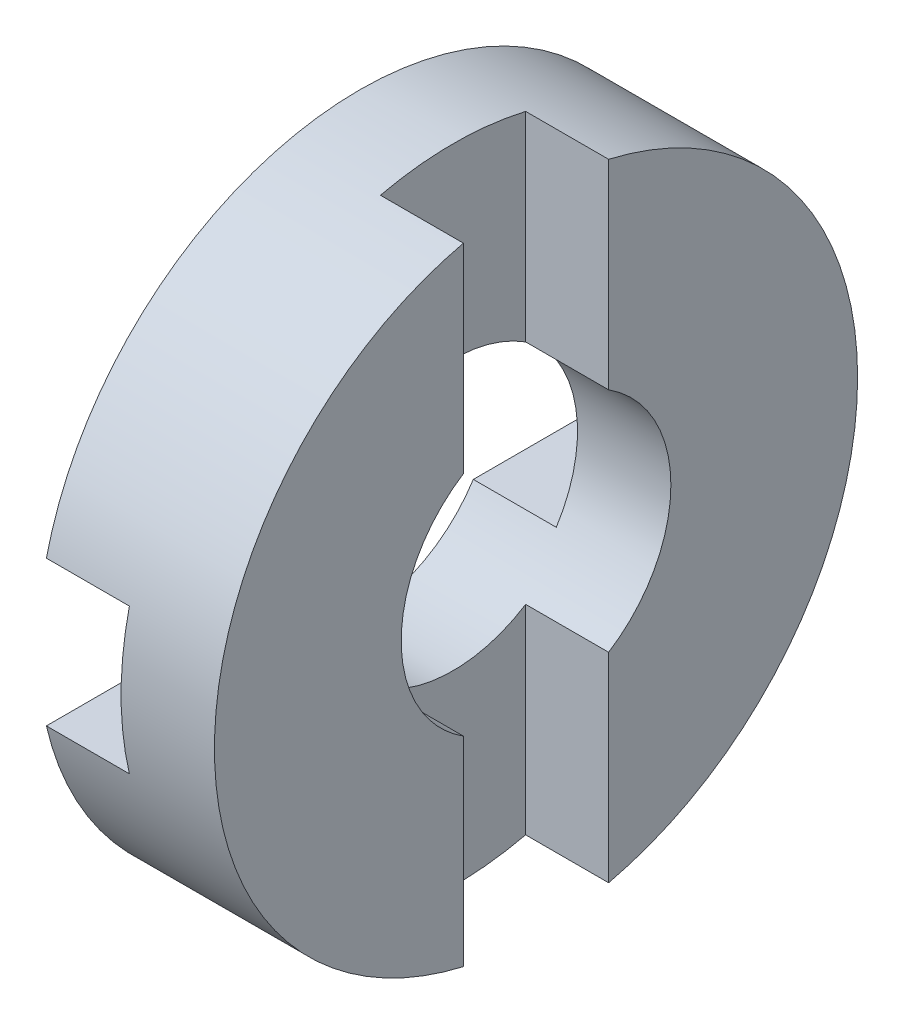
ISO-10303-21;
HEADER;
FILE_DESCRIPTION(('STEP AP214'),'2;1');
FILE_NAME('part.step','',(''),(''),'','','');
FILE_SCHEMA(('AUTOMOTIVE_DESIGN { 1 0 10303 214 1 1 1 1 }'));
ENDSEC;
DATA;
#1=APPLICATION_CONTEXT('core data for automotive mechanical design processes');
#2=APPLICATION_PROTOCOL_DEFINITION('international standard','automotive_design',2000,#1);
#3=PRODUCT_CONTEXT('',#1,'mechanical');
#4=PRODUCT('Part','Part','',(#3));
#5=PRODUCT_RELATED_PRODUCT_CATEGORY('part','',(#4));
#6=PRODUCT_DEFINITION_FORMATION('','',#4);
#7=PRODUCT_DEFINITION_CONTEXT('part definition',#1,'design');
#8=PRODUCT_DEFINITION('design','',#6,#7);
#9=PRODUCT_DEFINITION_SHAPE('','',#8);
#10=(LENGTH_UNIT() NAMED_UNIT(*) SI_UNIT(.MILLI.,.METRE.));
#11=(NAMED_UNIT(*) PLANE_ANGLE_UNIT() SI_UNIT($,.RADIAN.));
#12=(NAMED_UNIT(*) SI_UNIT($,.STERADIAN.) SOLID_ANGLE_UNIT());
#13=UNCERTAINTY_MEASURE_WITH_UNIT(LENGTH_MEASURE(1.E-05),#10,'distance_accuracy_value','');
#14=(GEOMETRIC_REPRESENTATION_CONTEXT(3) GLOBAL_UNCERTAINTY_ASSIGNED_CONTEXT((#13)) GLOBAL_UNIT_ASSIGNED_CONTEXT((#10,
#11,#12)) REPRESENTATION_CONTEXT('',''));
#15=CARTESIAN_POINT('',(0.,0.,0.));
#16=DIRECTION('',(0.,0.,1.));
#17=DIRECTION('',(1.,0.,0.));
#18=AXIS2_PLACEMENT_3D('',#15,#16,#17);
#19=CARTESIAN_POINT('',(8.5,6.5,0.));
#20=DIRECTION('',(-1.,0.,0.));
#21=DIRECTION('',(0.,0.,1.));
#22=AXIS2_PLACEMENT_3D('',#19,#20,#21);
#23=PLANE('',#22);
#24=CARTESIAN_POINT('',(8.5,0.,0.));
#25=DIRECTION('',(-1.,0.,0.));
#26=DIRECTION('',(0.,0.,1.));
#27=AXIS2_PLACEMENT_3D('',#24,#25,#26);
#28=CIRCLE('',#27,15.5);
#29=CARTESIAN_POINT('',(8.5,-15.0996688705415,3.5));
#30=VERTEX_POINT('',#29);
#31=CARTESIAN_POINT('',(8.5,15.0996688705415,3.5));
#32=VERTEX_POINT('',#31);
#33=EDGE_CURVE('E177',#30,#32,#28,.T.);
#34=ORIENTED_EDGE('',*,*,#33,.F.);
#35=DIRECTION('',(0.,1.,0.));
#36=VECTOR('',#35,1.);
#37=CARTESIAN_POINT('',(8.5,-15.5,3.5));
#38=LINE('',#37,#36);
#39=CARTESIAN_POINT('',(8.5,-5.47722557505166,3.5));
#40=VERTEX_POINT('',#39);
#41=EDGE_CURVE('E231',#30,#40,#38,.T.);
#42=ORIENTED_EDGE('',*,*,#41,.T.);
#43=CARTESIAN_POINT('',(8.5,0.,0.));
#44=DIRECTION('',(-1.,0.,0.));
#45=DIRECTION('',(0.,0.,1.));
#46=AXIS2_PLACEMENT_3D('',#43,#44,#45);
#47=CIRCLE('',#46,6.5);
#48=CARTESIAN_POINT('',(8.5,5.47722557505166,3.5));
#49=VERTEX_POINT('',#48);
#50=EDGE_CURVE('E183',#40,#49,#47,.T.);
#51=ORIENTED_EDGE('',*,*,#50,.T.);
#52=EDGE_CURVE('E227',#49,#32,#38,.T.);
#53=ORIENTED_EDGE('',*,*,#52,.T.);
#54=EDGE_LOOP('',(#34,#42,#51,#53));
#55=FACE_BOUND('',#54,.T.);
#56=ADVANCED_FACE('F41',(#55),#23,.F.);
#57=CARTESIAN_POINT('',(0.,6.5,0.));
#58=DIRECTION('',(1.,0.,0.));
#59=DIRECTION('',(0.,0.,-1.));
#60=AXIS2_PLACEMENT_3D('',#57,#58,#59);
#61=PLANE('',#60);
#62=CARTESIAN_POINT('',(0.,0.,0.));
#63=DIRECTION('',(-1.,0.,0.));
#64=DIRECTION('',(0.,0.,1.));
#65=AXIS2_PLACEMENT_3D('',#62,#63,#64);
#66=CIRCLE('',#65,15.5);
#67=CARTESIAN_POINT('',(0.,3.5,15.0996688705415));
#68=VERTEX_POINT('',#67);
#69=CARTESIAN_POINT('',(0.,3.5,-15.0996688705415));
#70=VERTEX_POINT('',#69);
#71=EDGE_CURVE('E180',#68,#70,#66,.T.);
#72=ORIENTED_EDGE('',*,*,#71,.T.);
#73=DIRECTION('',(0.,0.,1.));
#74=VECTOR('',#73,1.);
#75=CARTESIAN_POINT('',(0.,3.5,-15.5));
#76=LINE('',#75,#74);
#77=CARTESIAN_POINT('',(0.,3.5,-5.47722557505166));
#78=VERTEX_POINT('',#77);
#79=EDGE_CURVE('E247',#70,#78,#76,.T.);
#80=ORIENTED_EDGE('',*,*,#79,.T.);
#81=CARTESIAN_POINT('',(0.,0.,0.));
#82=DIRECTION('',(-1.,0.,0.));
#83=DIRECTION('',(0.,0.,1.));
#84=AXIS2_PLACEMENT_3D('',#81,#82,#83);
#85=CIRCLE('',#84,6.5);
#86=CARTESIAN_POINT('',(0.,3.5,5.47722557505166));
#87=VERTEX_POINT('',#86);
#88=EDGE_CURVE('E273',#87,#78,#85,.T.);
#89=ORIENTED_EDGE('',*,*,#88,.F.);
#90=EDGE_CURVE('E244',#87,#68,#76,.T.);
#91=ORIENTED_EDGE('',*,*,#90,.T.);
#92=EDGE_LOOP('',(#72,#80,#89,#91));
#93=FACE_BOUND('',#92,.T.);
#94=ADVANCED_FACE('F298',(#93),#61,.F.);
#95=CARTESIAN_POINT('',(0.,-3.5,-15.0996688705415));
#96=VERTEX_POINT('',#95);
#97=CARTESIAN_POINT('',(0.,-3.5,15.0996688705415));
#98=VERTEX_POINT('',#97);
#99=EDGE_CURVE('E176',#96,#98,#66,.T.);
#100=ORIENTED_EDGE('',*,*,#99,.T.);
#101=DIRECTION('',(0.,0.,1.));
#102=VECTOR('',#101,1.);
#103=CARTESIAN_POINT('',(0.,-3.5,-15.5));
#104=LINE('',#103,#102);
#105=CARTESIAN_POINT('',(0.,-3.5,5.47722557505166));
#106=VERTEX_POINT('',#105);
#107=EDGE_CURVE('E243',#106,#98,#104,.T.);
#108=ORIENTED_EDGE('',*,*,#107,.F.);
#109=CARTESIAN_POINT('',(0.,-3.5,-5.47722557505166));
#110=VERTEX_POINT('',#109);
#111=EDGE_CURVE('E272',#110,#106,#85,.T.);
#112=ORIENTED_EDGE('',*,*,#111,.F.);
#113=EDGE_CURVE('E256',#96,#110,#104,.T.);
#114=ORIENTED_EDGE('',*,*,#113,.F.);
#115=EDGE_LOOP('',(#100,#108,#112,#114));
#116=FACE_BOUND('',#115,.T.);
#117=ADVANCED_FACE('F43',(#116),#61,.F.);
#118=CARTESIAN_POINT('',(0.,0.,0.));
#119=DIRECTION('',(-1.,0.,0.));
#120=DIRECTION('',(0.,0.,1.));
#121=AXIS2_PLACEMENT_3D('',#118,#119,#120);
#122=CYLINDRICAL_SURFACE('',#121,15.5);
#123=CARTESIAN_POINT('',(4.,0.,0.));
#124=DIRECTION('',(1.,0.,0.));
#125=DIRECTION('',(0.,0.,-1.));
#126=AXIS2_PLACEMENT_3D('',#123,#124,#125);
#127=CIRCLE('',#126,15.5);
#128=CARTESIAN_POINT('',(4.,-3.5,-15.0996688705415));
#129=VERTEX_POINT('',#128);
#130=CARTESIAN_POINT('',(4.,3.5,-15.0996688705415));
#131=VERTEX_POINT('',#130);
#132=EDGE_CURVE('E264',#129,#131,#127,.T.);
#133=ORIENTED_EDGE('',*,*,#132,.T.);
#134=DIRECTION('',(-1.,0.,0.));
#135=VECTOR('',#134,1.);
#136=CARTESIAN_POINT('',(0.,3.5,-15.0996688705415));
#137=LINE('',#136,#135);
#138=EDGE_CURVE('E270',#131,#70,#137,.T.);
#139=ORIENTED_EDGE('',*,*,#138,.T.);
#140=ORIENTED_EDGE('',*,*,#71,.F.);
#141=DIRECTION('',(-1.,0.,0.));
#142=VECTOR('',#141,1.);
#143=CARTESIAN_POINT('',(0.,3.5,15.0996688705415));
#144=LINE('',#143,#142);
#145=CARTESIAN_POINT('',(4.,3.5,15.0996688705415));
#146=VERTEX_POINT('',#145);
#147=EDGE_CURVE('E267',#68,#146,#144,.F.);
#148=ORIENTED_EDGE('',*,*,#147,.T.);
#149=CARTESIAN_POINT('',(4.,-3.5,15.0996688705415));
#150=VERTEX_POINT('',#149);
#151=EDGE_CURVE('E266',#146,#150,#127,.T.);
#152=ORIENTED_EDGE('',*,*,#151,.T.);
#153=DIRECTION('',(-1.,0.,0.));
#154=VECTOR('',#153,1.);
#155=CARTESIAN_POINT('',(0.,-3.5,15.0996688705415));
#156=LINE('',#155,#154);
#157=EDGE_CURVE('E261',#150,#98,#156,.T.);
#158=ORIENTED_EDGE('',*,*,#157,.T.);
#159=ORIENTED_EDGE('',*,*,#99,.F.);
#160=DIRECTION('',(-1.,0.,0.));
#161=VECTOR('',#160,1.);
#162=CARTESIAN_POINT('',(0.,-3.5,-15.0996688705415));
#163=LINE('',#162,#161);
#164=EDGE_CURVE('E258',#96,#129,#163,.F.);
#165=ORIENTED_EDGE('',*,*,#164,.T.);
#166=EDGE_LOOP('',(#133,#139,#140,#148,#152,#158,#159,#165));
#167=FACE_BOUND('',#166,.T.);
#168=ORIENTED_EDGE('',*,*,#33,.T.);
#169=DIRECTION('',(-1.,0.,0.));
#170=VECTOR('',#169,1.);
#171=CARTESIAN_POINT('',(0.,15.0996688705415,3.5));
#172=LINE('',#171,#170);
#173=CARTESIAN_POINT('',(4.5,15.0996688705415,3.5));
#174=VERTEX_POINT('',#173);
#175=EDGE_CURVE('E240',#32,#174,#172,.T.);
#176=ORIENTED_EDGE('',*,*,#175,.T.);
#177=CARTESIAN_POINT('',(4.5,0.,0.));
#178=DIRECTION('',(-1.,0.,0.));
#179=DIRECTION('',(0.,0.,1.));
#180=AXIS2_PLACEMENT_3D('',#177,#178,#179);
#181=CIRCLE('',#180,15.5);
#182=CARTESIAN_POINT('',(4.5,15.0996688705415,-3.5));
#183=VERTEX_POINT('',#182);
#184=EDGE_CURVE('E237',#174,#183,#181,.T.);
#185=ORIENTED_EDGE('',*,*,#184,.T.);
#186=DIRECTION('',(-1.,0.,0.));
#187=VECTOR('',#186,1.);
#188=CARTESIAN_POINT('',(0.,15.0996688705415,-3.5));
#189=LINE('',#188,#187);
#190=CARTESIAN_POINT('',(8.5,15.0996688705415,-3.5));
#191=VERTEX_POINT('',#190);
#192=EDGE_CURVE('E161',#183,#191,#189,.F.);
#193=ORIENTED_EDGE('',*,*,#192,.T.);
#194=CARTESIAN_POINT('',(8.5,-15.0996688705415,-3.5));
#195=VERTEX_POINT('',#194);
#196=EDGE_CURVE('E168',#191,#195,#28,.T.);
#197=ORIENTED_EDGE('',*,*,#196,.T.);
#198=DIRECTION('',(-1.,0.,0.));
#199=VECTOR('',#198,1.);
#200=CARTESIAN_POINT('',(0.,-15.0996688705415,-3.5));
#201=LINE('',#200,#199);
#202=CARTESIAN_POINT('',(4.5,-15.0996688705415,-3.5));
#203=VERTEX_POINT('',#202);
#204=EDGE_CURVE('E154',#195,#203,#201,.T.);
#205=ORIENTED_EDGE('',*,*,#204,.T.);
#206=CARTESIAN_POINT('',(4.5,-15.0996688705415,3.5));
#207=VERTEX_POINT('',#206);
#208=EDGE_CURVE('E160',#203,#207,#181,.T.);
#209=ORIENTED_EDGE('',*,*,#208,.T.);
#210=DIRECTION('',(-1.,0.,0.));
#211=VECTOR('',#210,1.);
#212=CARTESIAN_POINT('',(0.,-15.0996688705415,3.5));
#213=LINE('',#212,#211);
#214=EDGE_CURVE('E226',#207,#30,#213,.F.);
#215=ORIENTED_EDGE('',*,*,#214,.T.);
#216=EDGE_LOOP('',(#168,#176,#185,#193,#197,#205,#209,#215));
#217=FACE_BOUND('',#216,.T.);
#218=ADVANCED_FACE('F175',(#167,#217),#122,.T.);
#219=ORIENTED_EDGE('',*,*,#196,.F.);
#220=DIRECTION('',(0.,1.,0.));
#221=VECTOR('',#220,1.);
#222=CARTESIAN_POINT('',(8.5,-15.5,-3.5));
#223=LINE('',#222,#221);
#224=CARTESIAN_POINT('',(8.5,5.47722557505166,-3.5));
#225=VERTEX_POINT('',#224);
#226=EDGE_CURVE('E171',#225,#191,#223,.T.);
#227=ORIENTED_EDGE('',*,*,#226,.F.);
#228=CARTESIAN_POINT('',(8.5,-5.47722557505166,-3.5));
#229=VERTEX_POINT('',#228);
#230=EDGE_CURVE('E170',#225,#229,#47,.T.);
#231=ORIENTED_EDGE('',*,*,#230,.T.);
#232=EDGE_CURVE('E64',#195,#229,#223,.T.);
#233=ORIENTED_EDGE('',*,*,#232,.F.);
#234=EDGE_LOOP('',(#219,#227,#231,#233));
#235=FACE_BOUND('',#234,.T.);
#236=ADVANCED_FACE('F166',(#235),#23,.F.);
#237=CARTESIAN_POINT('',(0.,0.,0.));
#238=DIRECTION('',(-1.,0.,0.));
#239=DIRECTION('',(0.,0.,1.));
#240=AXIS2_PLACEMENT_3D('',#237,#238,#239);
#241=CYLINDRICAL_SURFACE('',#240,6.5);
#242=ORIENTED_EDGE('',*,*,#50,.F.);
#243=DIRECTION('',(-1.,0.,0.));
#244=VECTOR('',#243,1.);
#245=CARTESIAN_POINT('',(0.,-5.47722557505166,3.5));
#246=LINE('',#245,#244);
#247=CARTESIAN_POINT('',(4.5,-5.47722557505166,3.5));
#248=VERTEX_POINT('',#247);
#249=EDGE_CURVE('E11',#40,#248,#246,.T.);
#250=ORIENTED_EDGE('',*,*,#249,.T.);
#251=CARTESIAN_POINT('',(4.5,0.,0.));
#252=DIRECTION('',(-1.,0.,0.));
#253=DIRECTION('',(0.,0.,1.));
#254=AXIS2_PLACEMENT_3D('',#251,#252,#253);
#255=CIRCLE('',#254,6.5);
#256=CARTESIAN_POINT('',(4.5,-5.47722557505166,-3.5));
#257=VERTEX_POINT('',#256);
#258=EDGE_CURVE('E49',#248,#257,#255,.F.);
#259=ORIENTED_EDGE('',*,*,#258,.T.);
#260=DIRECTION('',(-1.,0.,0.));
#261=VECTOR('',#260,1.);
#262=CARTESIAN_POINT('',(0.,-5.47722557505166,-3.5));
#263=LINE('',#262,#261);
#264=EDGE_CURVE('E210',#257,#229,#263,.F.);
#265=ORIENTED_EDGE('',*,*,#264,.T.);
#266=ORIENTED_EDGE('',*,*,#230,.F.);
#267=DIRECTION('',(-1.,0.,0.));
#268=VECTOR('',#267,1.);
#269=CARTESIAN_POINT('',(0.,5.47722557505166,-3.5));
#270=LINE('',#269,#268);
#271=CARTESIAN_POINT('',(4.5,5.47722557505166,-3.5));
#272=VERTEX_POINT('',#271);
#273=EDGE_CURVE('E202',#225,#272,#270,.T.);
#274=ORIENTED_EDGE('',*,*,#273,.T.);
#275=CARTESIAN_POINT('',(4.5,5.47722557505166,3.5));
#276=VERTEX_POINT('',#275);
#277=EDGE_CURVE('E205',#272,#276,#255,.F.);
#278=ORIENTED_EDGE('',*,*,#277,.T.);
#279=DIRECTION('',(-1.,0.,0.));
#280=VECTOR('',#279,1.);
#281=CARTESIAN_POINT('',(0.,5.47722557505166,3.5));
#282=LINE('',#281,#280);
#283=EDGE_CURVE('E208',#276,#49,#282,.F.);
#284=ORIENTED_EDGE('',*,*,#283,.T.);
#285=EDGE_LOOP('',(#242,#250,#259,#265,#266,#274,#278,#284));
#286=FACE_BOUND('',#285,.T.);
#287=CARTESIAN_POINT('',(4.,0.,0.));
#288=DIRECTION('',(1.,0.,0.));
#289=DIRECTION('',(0.,0.,-1.));
#290=AXIS2_PLACEMENT_3D('',#287,#288,#289);
#291=CIRCLE('',#290,6.5);
#292=CARTESIAN_POINT('',(4.,-3.5,5.47722557505166));
#293=VERTEX_POINT('',#292);
#294=CARTESIAN_POINT('',(4.,3.5,5.47722557505166));
#295=VERTEX_POINT('',#294);
#296=EDGE_CURVE('E193',#293,#295,#291,.F.);
#297=ORIENTED_EDGE('',*,*,#296,.T.);
#298=DIRECTION('',(-1.,0.,0.));
#299=VECTOR('',#298,1.);
#300=CARTESIAN_POINT('',(0.,3.5,5.47722557505166));
#301=LINE('',#300,#299);
#302=EDGE_CURVE('E199',#295,#87,#301,.T.);
#303=ORIENTED_EDGE('',*,*,#302,.T.);
#304=ORIENTED_EDGE('',*,*,#88,.T.);
#305=DIRECTION('',(-1.,0.,0.));
#306=VECTOR('',#305,1.);
#307=CARTESIAN_POINT('',(0.,3.5,-5.47722557505166));
#308=LINE('',#307,#306);
#309=CARTESIAN_POINT('',(4.,3.5,-5.47722557505166));
#310=VERTEX_POINT('',#309);
#311=EDGE_CURVE('E192',#78,#310,#308,.F.);
#312=ORIENTED_EDGE('',*,*,#311,.T.);
#313=CARTESIAN_POINT('',(4.,-3.5,-5.47722557505166));
#314=VERTEX_POINT('',#313);
#315=EDGE_CURVE('E189',#310,#314,#291,.F.);
#316=ORIENTED_EDGE('',*,*,#315,.T.);
#317=DIRECTION('',(-1.,0.,0.));
#318=VECTOR('',#317,1.);
#319=CARTESIAN_POINT('',(0.,-3.5,-5.47722557505166));
#320=LINE('',#319,#318);
#321=EDGE_CURVE('E186',#314,#110,#320,.T.);
#322=ORIENTED_EDGE('',*,*,#321,.T.);
#323=ORIENTED_EDGE('',*,*,#111,.T.);
#324=DIRECTION('',(-1.,0.,0.));
#325=VECTOR('',#324,1.);
#326=CARTESIAN_POINT('',(0.,-3.5,5.47722557505166));
#327=LINE('',#326,#325);
#328=EDGE_CURVE('E196',#106,#293,#327,.F.);
#329=ORIENTED_EDGE('',*,*,#328,.T.);
#330=EDGE_LOOP('',(#297,#303,#304,#312,#316,#322,#323,#329));
#331=FACE_BOUND('',#330,.T.);
#332=ADVANCED_FACE('F214',(#286,#331),#241,.F.);
#333=CARTESIAN_POINT('',(0.,-3.5,-15.5));
#334=DIRECTION('',(0.,-1.,0.));
#335=DIRECTION('',(0.,0.,-1.));
#336=AXIS2_PLACEMENT_3D('',#333,#334,#335);
#337=PLANE('',#336);
#338=ORIENTED_EDGE('',*,*,#113,.T.);
#339=ORIENTED_EDGE('',*,*,#321,.F.);
#340=DIRECTION('',(0.,0.,1.));
#341=VECTOR('',#340,1.);
#342=CARTESIAN_POINT('',(4.,-3.5,-15.5));
#343=LINE('',#342,#341);
#344=EDGE_CURVE('E252',#129,#314,#343,.T.);
#345=ORIENTED_EDGE('',*,*,#344,.F.);
#346=ORIENTED_EDGE('',*,*,#164,.F.);
#347=EDGE_LOOP('',(#338,#339,#345,#346));
#348=FACE_BOUND('',#347,.T.);
#349=ADVANCED_FACE('F309',(#348),#337,.F.);
#350=CARTESIAN_POINT('',(4.,3.5,-15.5));
#351=DIRECTION('',(1.,0.,0.));
#352=DIRECTION('',(0.,0.,-1.));
#353=AXIS2_PLACEMENT_3D('',#350,#351,#352);
#354=PLANE('',#353);
#355=ORIENTED_EDGE('',*,*,#132,.F.);
#356=ORIENTED_EDGE('',*,*,#344,.T.);
#357=ORIENTED_EDGE('',*,*,#315,.F.);
#358=DIRECTION('',(0.,0.,1.));
#359=VECTOR('',#358,1.);
#360=CARTESIAN_POINT('',(4.,3.5,-15.5));
#361=LINE('',#360,#359);
#362=EDGE_CURVE('E248',#131,#310,#361,.T.);
#363=ORIENTED_EDGE('',*,*,#362,.F.);
#364=EDGE_LOOP('',(#355,#356,#357,#363));
#365=FACE_BOUND('',#364,.T.);
#366=ADVANCED_FACE('F307',(#365),#354,.F.);
#367=CARTESIAN_POINT('',(0.,3.5,-15.5));
#368=DIRECTION('',(0.,1.,0.));
#369=DIRECTION('',(0.,0.,1.));
#370=AXIS2_PLACEMENT_3D('',#367,#368,#369);
#371=PLANE('',#370);
#372=ORIENTED_EDGE('',*,*,#362,.T.);
#373=ORIENTED_EDGE('',*,*,#311,.F.);
#374=ORIENTED_EDGE('',*,*,#79,.F.);
#375=ORIENTED_EDGE('',*,*,#138,.F.);
#376=EDGE_LOOP('',(#372,#373,#374,#375));
#377=FACE_BOUND('',#376,.T.);
#378=ADVANCED_FACE('F302',(#377),#371,.F.);
#379=ORIENTED_EDGE('',*,*,#90,.F.);
#380=ORIENTED_EDGE('',*,*,#302,.F.);
#381=EDGE_CURVE('E249',#295,#146,#361,.T.);
#382=ORIENTED_EDGE('',*,*,#381,.T.);
#383=ORIENTED_EDGE('',*,*,#147,.F.);
#384=EDGE_LOOP('',(#379,#380,#382,#383));
#385=FACE_BOUND('',#384,.T.);
#386=ADVANCED_FACE('F294',(#385),#371,.F.);
#387=ORIENTED_EDGE('',*,*,#381,.F.);
#388=ORIENTED_EDGE('',*,*,#296,.F.);
#389=EDGE_CURVE('E253',#293,#150,#343,.T.);
#390=ORIENTED_EDGE('',*,*,#389,.T.);
#391=ORIENTED_EDGE('',*,*,#151,.F.);
#392=EDGE_LOOP('',(#387,#388,#390,#391));
#393=FACE_BOUND('',#392,.T.);
#394=ADVANCED_FACE('F291',(#393),#354,.F.);
#395=ORIENTED_EDGE('',*,*,#389,.F.);
#396=ORIENTED_EDGE('',*,*,#328,.F.);
#397=ORIENTED_EDGE('',*,*,#107,.T.);
#398=ORIENTED_EDGE('',*,*,#157,.F.);
#399=EDGE_LOOP('',(#395,#396,#397,#398));
#400=FACE_BOUND('',#399,.T.);
#401=ADVANCED_FACE('F286',(#400),#337,.F.);
#402=CARTESIAN_POINT('',(8.5,-15.5,-3.5));
#403=DIRECTION('',(0.,0.,-1.));
#404=DIRECTION('',(-1.,0.,0.));
#405=AXIS2_PLACEMENT_3D('',#402,#403,#404);
#406=PLANE('',#405);
#407=DIRECTION('',(0.,1.,0.));
#408=VECTOR('',#407,1.);
#409=CARTESIAN_POINT('',(4.5,-15.5,-3.5));
#410=LINE('',#409,#408);
#411=EDGE_CURVE('E56',#272,#183,#410,.T.);
#412=ORIENTED_EDGE('',*,*,#411,.F.);
#413=ORIENTED_EDGE('',*,*,#273,.F.);
#414=ORIENTED_EDGE('',*,*,#226,.T.);
#415=ORIENTED_EDGE('',*,*,#192,.F.);
#416=EDGE_LOOP('',(#412,#413,#414,#415));
#417=FACE_BOUND('',#416,.T.);
#418=ADVANCED_FACE('F319',(#417),#406,.F.);
#419=CARTESIAN_POINT('',(4.5,-15.5,3.5));
#420=DIRECTION('',(-1.,0.,0.));
#421=DIRECTION('',(0.,0.,1.));
#422=AXIS2_PLACEMENT_3D('',#419,#420,#421);
#423=PLANE('',#422);
#424=DIRECTION('',(0.,1.,0.));
#425=VECTOR('',#424,1.);
#426=CARTESIAN_POINT('',(4.5,-15.5,3.5));
#427=LINE('',#426,#425);
#428=EDGE_CURVE('E228',#276,#174,#427,.T.);
#429=ORIENTED_EDGE('',*,*,#428,.F.);
#430=ORIENTED_EDGE('',*,*,#277,.F.);
#431=ORIENTED_EDGE('',*,*,#411,.T.);
#432=ORIENTED_EDGE('',*,*,#184,.F.);
#433=EDGE_LOOP('',(#429,#430,#431,#432));
#434=FACE_BOUND('',#433,.T.);
#435=ADVANCED_FACE('F400',(#434),#423,.F.);
#436=CARTESIAN_POINT('',(8.5,-15.5,3.5));
#437=DIRECTION('',(0.,0.,1.));
#438=DIRECTION('',(1.,0.,0.));
#439=AXIS2_PLACEMENT_3D('',#436,#437,#438);
#440=PLANE('',#439);
#441=ORIENTED_EDGE('',*,*,#52,.F.);
#442=ORIENTED_EDGE('',*,*,#283,.F.);
#443=ORIENTED_EDGE('',*,*,#428,.T.);
#444=ORIENTED_EDGE('',*,*,#175,.F.);
#445=EDGE_LOOP('',(#441,#442,#443,#444));
#446=FACE_BOUND('',#445,.T.);
#447=ADVANCED_FACE('F409',(#446),#440,.F.);
#448=EDGE_CURVE('E220',#207,#248,#427,.T.);
#449=ORIENTED_EDGE('',*,*,#448,.T.);
#450=ORIENTED_EDGE('',*,*,#249,.F.);
#451=ORIENTED_EDGE('',*,*,#41,.F.);
#452=ORIENTED_EDGE('',*,*,#214,.F.);
#453=EDGE_LOOP('',(#449,#450,#451,#452));
#454=FACE_BOUND('',#453,.T.);
#455=ADVANCED_FACE('F223',(#454),#440,.F.);
#456=EDGE_CURVE('E157',#203,#257,#410,.T.);
#457=ORIENTED_EDGE('',*,*,#456,.T.);
#458=ORIENTED_EDGE('',*,*,#258,.F.);
#459=ORIENTED_EDGE('',*,*,#448,.F.);
#460=ORIENTED_EDGE('',*,*,#208,.F.);
#461=EDGE_LOOP('',(#457,#458,#459,#460));
#462=FACE_BOUND('',#461,.T.);
#463=ADVANCED_FACE('F219',(#462),#423,.F.);
#464=ORIENTED_EDGE('',*,*,#232,.T.);
#465=ORIENTED_EDGE('',*,*,#264,.F.);
#466=ORIENTED_EDGE('',*,*,#456,.F.);
#467=ORIENTED_EDGE('',*,*,#204,.F.);
#468=EDGE_LOOP('',(#464,#465,#466,#467));
#469=FACE_BOUND('',#468,.T.);
#470=ADVANCED_FACE('F155',(#469),#406,.F.);
#471=CLOSED_SHELL('',(#56,#94,#117,#218,#236,#332,#349,#366,#378,#386,#394,#401,#418,#435,#447,
#455,#463,#470));
#472=MANIFOLD_SOLID_BREP('B2',#471);
#473=ADVANCED_BREP_SHAPE_REPRESENTATION('',(#18,#472),#14);
#474=SHAPE_DEFINITION_REPRESENTATION(#9,#473);
ENDSEC;
END-ISO-10303-21;
